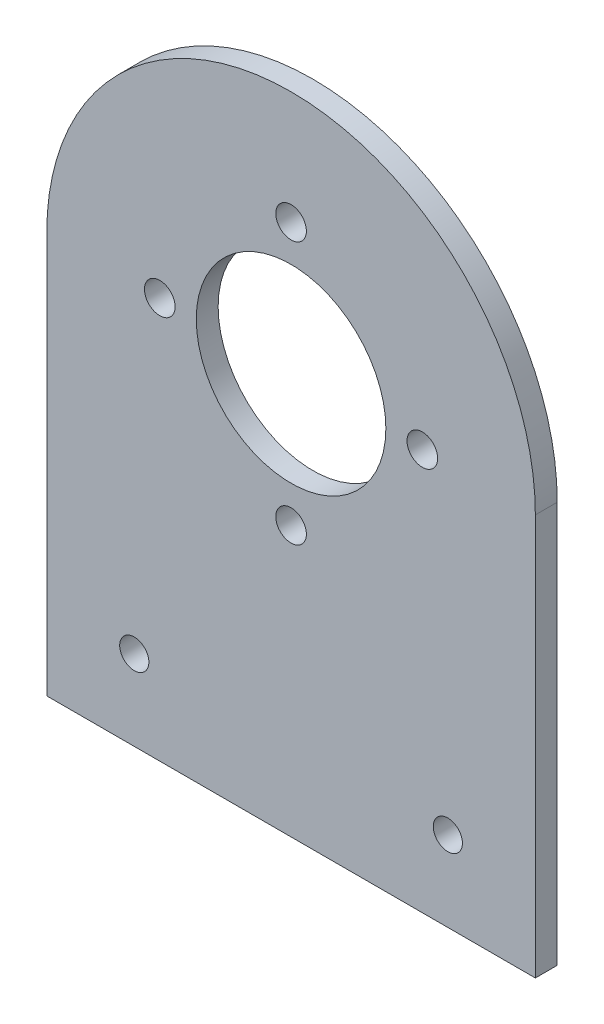
ISO-10303-21;
HEADER;
FILE_DESCRIPTION(('STEP AP214'),'2;1');
FILE_NAME('part.step','',(''),(''),'','','');
FILE_SCHEMA(('AUTOMOTIVE_DESIGN { 1 0 10303 214 1 1 1 1 }'));
ENDSEC;
DATA;
#1=APPLICATION_CONTEXT('core data for automotive mechanical design processes');
#2=APPLICATION_PROTOCOL_DEFINITION('international standard','automotive_design',2000,#1);
#3=PRODUCT_CONTEXT('',#1,'mechanical');
#4=PRODUCT('Part','Part','',(#3));
#5=PRODUCT_RELATED_PRODUCT_CATEGORY('part','',(#4));
#6=PRODUCT_DEFINITION_FORMATION('','',#4);
#7=PRODUCT_DEFINITION_CONTEXT('part definition',#1,'design');
#8=PRODUCT_DEFINITION('design','',#6,#7);
#9=PRODUCT_DEFINITION_SHAPE('','',#8);
#10=(LENGTH_UNIT() NAMED_UNIT(*) SI_UNIT(.MILLI.,.METRE.));
#11=(NAMED_UNIT(*) PLANE_ANGLE_UNIT() SI_UNIT($,.RADIAN.));
#12=(NAMED_UNIT(*) SI_UNIT($,.STERADIAN.) SOLID_ANGLE_UNIT());
#13=UNCERTAINTY_MEASURE_WITH_UNIT(LENGTH_MEASURE(1.E-05),#10,'distance_accuracy_value','');
#14=(GEOMETRIC_REPRESENTATION_CONTEXT(3) GLOBAL_UNCERTAINTY_ASSIGNED_CONTEXT((#13)) GLOBAL_UNIT_ASSIGNED_CONTEXT((#10,
#11,#12)) REPRESENTATION_CONTEXT('',''));
#15=CARTESIAN_POINT('',(0.,0.,0.));
#16=DIRECTION('',(0.,0.,1.));
#17=DIRECTION('',(1.,0.,0.));
#18=AXIS2_PLACEMENT_3D('',#15,#16,#17);
#19=CARTESIAN_POINT('',(0.,55.,3.));
#20=DIRECTION('',(0.,0.,1.));
#21=DIRECTION('',(1.,0.,0.));
#22=AXIS2_PLACEMENT_3D('',#19,#20,#21);
#23=PLANE('',#22);
#24=CARTESIAN_POINT('',(21.5,11.,3.));
#25=DIRECTION('',(0.,0.,1.));
#26=DIRECTION('',(-1.,0.,0.));
#27=AXIS2_PLACEMENT_3D('',#24,#25,#26);
#28=CIRCLE('',#27,2.);
#29=CARTESIAN_POINT('',(19.5,11.,3.));
#30=VERTEX_POINT('',#29);
#31=EDGE_CURVE('E149',#30,#30,#28,.T.);
#32=ORIENTED_EDGE('',*,*,#31,.F.);
#33=EDGE_LOOP('',(#32));
#34=FACE_BOUND('',#33,.T.);
#35=CARTESIAN_POINT('',(-18.,55.0000000000001,3.));
#36=DIRECTION('',(0.,0.,1.));
#37=DIRECTION('',(1.,0.,0.));
#38=AXIS2_PLACEMENT_3D('',#35,#36,#37);
#39=CIRCLE('',#38,2.1);
#40=CARTESIAN_POINT('',(-15.9,55.0000000000001,3.));
#41=VERTEX_POINT('',#40);
#42=EDGE_CURVE('E137',#41,#41,#39,.T.);
#43=ORIENTED_EDGE('',*,*,#42,.F.);
#44=EDGE_LOOP('',(#43));
#45=FACE_BOUND('',#44,.T.);
#46=CARTESIAN_POINT('',(0.,37.,3.));
#47=DIRECTION('',(0.,0.,1.));
#48=DIRECTION('',(1.,0.,0.));
#49=AXIS2_PLACEMENT_3D('',#46,#47,#48);
#50=CIRCLE('',#49,2.1);
#51=CARTESIAN_POINT('',(2.1,37.,3.));
#52=VERTEX_POINT('',#51);
#53=EDGE_CURVE('E125',#52,#52,#50,.T.);
#54=ORIENTED_EDGE('',*,*,#53,.F.);
#55=EDGE_LOOP('',(#54));
#56=FACE_BOUND('',#55,.T.);
#57=DIRECTION('',(0.,-1.,0.));
#58=VECTOR('',#57,1.);
#59=CARTESIAN_POINT('',(-33.5,55.,3.));
#60=LINE('',#59,#58);
#61=CARTESIAN_POINT('',(-33.5,55.,3.));
#62=VERTEX_POINT('',#61);
#63=CARTESIAN_POINT('',(-33.5,0.,3.));
#64=VERTEX_POINT('',#63);
#65=EDGE_CURVE('E95',#62,#64,#60,.T.);
#66=ORIENTED_EDGE('',*,*,#65,.T.);
#67=DIRECTION('',(1.,0.,0.));
#68=VECTOR('',#67,1.);
#69=CARTESIAN_POINT('',(-33.5,0.,3.));
#70=LINE('',#69,#68);
#71=CARTESIAN_POINT('',(33.5,0.,3.));
#72=VERTEX_POINT('',#71);
#73=EDGE_CURVE('E90',#64,#72,#70,.T.);
#74=ORIENTED_EDGE('',*,*,#73,.T.);
#75=DIRECTION('',(0.,1.,0.));
#76=VECTOR('',#75,1.);
#77=CARTESIAN_POINT('',(33.5,0.,3.));
#78=LINE('',#77,#76);
#79=CARTESIAN_POINT('',(33.5,55.,3.));
#80=VERTEX_POINT('',#79);
#81=EDGE_CURVE('E93',#72,#80,#78,.T.);
#82=ORIENTED_EDGE('',*,*,#81,.T.);
#83=CARTESIAN_POINT('',(0.,55.,3.));
#84=DIRECTION('',(0.,0.,1.));
#85=DIRECTION('',(1.,0.,0.));
#86=AXIS2_PLACEMENT_3D('',#83,#84,#85);
#87=CIRCLE('',#86,33.5);
#88=EDGE_CURVE('E60',#80,#62,#87,.T.);
#89=ORIENTED_EDGE('',*,*,#88,.T.);
#90=EDGE_LOOP('',(#66,#74,#82,#89));
#91=FACE_BOUND('',#90,.T.);
#92=CARTESIAN_POINT('',(0.,55.,3.));
#93=DIRECTION('',(0.,0.,1.));
#94=DIRECTION('',(1.,0.,0.));
#95=AXIS2_PLACEMENT_3D('',#92,#93,#94);
#96=CIRCLE('',#95,13.);
#97=CARTESIAN_POINT('',(13.,55.,3.));
#98=VERTEX_POINT('',#97);
#99=EDGE_CURVE('E110',#98,#98,#96,.T.);
#100=ORIENTED_EDGE('',*,*,#99,.F.);
#101=EDGE_LOOP('',(#100));
#102=FACE_BOUND('',#101,.T.);
#103=CARTESIAN_POINT('',(-21.5,11.,3.));
#104=DIRECTION('',(0.,0.,1.));
#105=DIRECTION('',(1.,0.,0.));
#106=AXIS2_PLACEMENT_3D('',#103,#104,#105);
#107=CIRCLE('',#106,2.);
#108=CARTESIAN_POINT('',(-19.5,11.,3.));
#109=VERTEX_POINT('',#108);
#110=EDGE_CURVE('E131',#109,#109,#107,.T.);
#111=ORIENTED_EDGE('',*,*,#110,.F.);
#112=EDGE_LOOP('',(#111));
#113=FACE_BOUND('',#112,.T.);
#114=CARTESIAN_POINT('',(1.30102056675283E-13,73.,3.));
#115=DIRECTION('',(0.,0.,1.));
#116=DIRECTION('',(1.,0.,0.));
#117=AXIS2_PLACEMENT_3D('',#114,#115,#116);
#118=CIRCLE('',#117,2.1);
#119=CARTESIAN_POINT('',(2.10000000000013,73.,3.));
#120=VERTEX_POINT('',#119);
#121=EDGE_CURVE('E143',#120,#120,#118,.T.);
#122=ORIENTED_EDGE('',*,*,#121,.F.);
#123=EDGE_LOOP('',(#122));
#124=FACE_BOUND('',#123,.T.);
#125=CARTESIAN_POINT('',(18.,54.9999999999998,3.));
#126=DIRECTION('',(0.,0.,1.));
#127=DIRECTION('',(1.,0.,0.));
#128=AXIS2_PLACEMENT_3D('',#125,#126,#127);
#129=CIRCLE('',#128,2.1);
#130=CARTESIAN_POINT('',(20.1,54.9999999999998,3.));
#131=VERTEX_POINT('',#130);
#132=EDGE_CURVE('E155',#131,#131,#129,.T.);
#133=ORIENTED_EDGE('',*,*,#132,.F.);
#134=EDGE_LOOP('',(#133));
#135=FACE_BOUND('',#134,.T.);
#136=ADVANCED_FACE('F43',(#34,#45,#56,#91,#102,#113,#124,#135),#23,.T.);
#137=CARTESIAN_POINT('',(0.,55.,0.));
#138=DIRECTION('',(0.,0.,1.));
#139=DIRECTION('',(1.,0.,0.));
#140=AXIS2_PLACEMENT_3D('',#137,#138,#139);
#141=PLANE('',#140);
#142=DIRECTION('',(0.,-1.,0.));
#143=VECTOR('',#142,1.);
#144=CARTESIAN_POINT('',(-33.5,55.,0.));
#145=LINE('',#144,#143);
#146=CARTESIAN_POINT('',(-33.5,55.,0.));
#147=VERTEX_POINT('',#146);
#148=CARTESIAN_POINT('',(-33.5,0.,0.));
#149=VERTEX_POINT('',#148);
#150=EDGE_CURVE('E107',#147,#149,#145,.T.);
#151=ORIENTED_EDGE('',*,*,#150,.F.);
#152=CARTESIAN_POINT('',(0.,55.,0.));
#153=DIRECTION('',(0.,0.,1.));
#154=DIRECTION('',(1.,0.,0.));
#155=AXIS2_PLACEMENT_3D('',#152,#153,#154);
#156=CIRCLE('',#155,33.5);
#157=CARTESIAN_POINT('',(33.5,55.,0.));
#158=VERTEX_POINT('',#157);
#159=EDGE_CURVE('E83',#158,#147,#156,.T.);
#160=ORIENTED_EDGE('',*,*,#159,.F.);
#161=DIRECTION('',(0.,1.,0.));
#162=VECTOR('',#161,1.);
#163=CARTESIAN_POINT('',(33.5,0.,0.));
#164=LINE('',#163,#162);
#165=CARTESIAN_POINT('',(33.5,0.,0.));
#166=VERTEX_POINT('',#165);
#167=EDGE_CURVE('E77',#166,#158,#164,.T.);
#168=ORIENTED_EDGE('',*,*,#167,.F.);
#169=DIRECTION('',(1.,0.,0.));
#170=VECTOR('',#169,1.);
#171=CARTESIAN_POINT('',(-33.5,0.,0.));
#172=LINE('',#171,#170);
#173=EDGE_CURVE('E99',#149,#166,#172,.T.);
#174=ORIENTED_EDGE('',*,*,#173,.F.);
#175=EDGE_LOOP('',(#151,#160,#168,#174));
#176=FACE_BOUND('',#175,.T.);
#177=CARTESIAN_POINT('',(0.,55.,0.));
#178=DIRECTION('',(0.,0.,1.));
#179=DIRECTION('',(1.,0.,0.));
#180=AXIS2_PLACEMENT_3D('',#177,#178,#179);
#181=CIRCLE('',#180,13.);
#182=CARTESIAN_POINT('',(13.,55.,0.));
#183=VERTEX_POINT('',#182);
#184=EDGE_CURVE('E122',#183,#183,#181,.T.);
#185=ORIENTED_EDGE('',*,*,#184,.T.);
#186=EDGE_LOOP('',(#185));
#187=FACE_BOUND('',#186,.T.);
#188=CARTESIAN_POINT('',(0.,37.,0.));
#189=DIRECTION('',(0.,0.,1.));
#190=DIRECTION('',(1.,0.,0.));
#191=AXIS2_PLACEMENT_3D('',#188,#189,#190);
#192=CIRCLE('',#191,2.1);
#193=CARTESIAN_POINT('',(2.1,37.,0.));
#194=VERTEX_POINT('',#193);
#195=EDGE_CURVE('E128',#194,#194,#192,.T.);
#196=ORIENTED_EDGE('',*,*,#195,.T.);
#197=EDGE_LOOP('',(#196));
#198=FACE_BOUND('',#197,.T.);
#199=CARTESIAN_POINT('',(-21.5,11.,0.));
#200=DIRECTION('',(0.,0.,1.));
#201=DIRECTION('',(1.,0.,0.));
#202=AXIS2_PLACEMENT_3D('',#199,#200,#201);
#203=CIRCLE('',#202,2.);
#204=CARTESIAN_POINT('',(-19.5,11.,0.));
#205=VERTEX_POINT('',#204);
#206=EDGE_CURVE('E134',#205,#205,#203,.T.);
#207=ORIENTED_EDGE('',*,*,#206,.T.);
#208=EDGE_LOOP('',(#207));
#209=FACE_BOUND('',#208,.T.);
#210=CARTESIAN_POINT('',(-18.,55.0000000000001,0.));
#211=DIRECTION('',(0.,0.,1.));
#212=DIRECTION('',(1.,0.,0.));
#213=AXIS2_PLACEMENT_3D('',#210,#211,#212);
#214=CIRCLE('',#213,2.1);
#215=CARTESIAN_POINT('',(-15.9,55.0000000000001,0.));
#216=VERTEX_POINT('',#215);
#217=EDGE_CURVE('E140',#216,#216,#214,.T.);
#218=ORIENTED_EDGE('',*,*,#217,.T.);
#219=EDGE_LOOP('',(#218));
#220=FACE_BOUND('',#219,.T.);
#221=CARTESIAN_POINT('',(1.30102056675283E-13,73.,0.));
#222=DIRECTION('',(0.,0.,1.));
#223=DIRECTION('',(1.,0.,0.));
#224=AXIS2_PLACEMENT_3D('',#221,#222,#223);
#225=CIRCLE('',#224,2.1);
#226=CARTESIAN_POINT('',(2.10000000000013,73.,0.));
#227=VERTEX_POINT('',#226);
#228=EDGE_CURVE('E146',#227,#227,#225,.T.);
#229=ORIENTED_EDGE('',*,*,#228,.T.);
#230=EDGE_LOOP('',(#229));
#231=FACE_BOUND('',#230,.T.);
#232=CARTESIAN_POINT('',(21.5,11.,0.));
#233=DIRECTION('',(0.,0.,1.));
#234=DIRECTION('',(-1.,0.,0.));
#235=AXIS2_PLACEMENT_3D('',#232,#233,#234);
#236=CIRCLE('',#235,2.);
#237=CARTESIAN_POINT('',(19.5,11.,0.));
#238=VERTEX_POINT('',#237);
#239=EDGE_CURVE('E152',#238,#238,#236,.T.);
#240=ORIENTED_EDGE('',*,*,#239,.T.);
#241=EDGE_LOOP('',(#240));
#242=FACE_BOUND('',#241,.T.);
#243=CARTESIAN_POINT('',(18.,54.9999999999998,0.));
#244=DIRECTION('',(0.,0.,1.));
#245=DIRECTION('',(1.,0.,0.));
#246=AXIS2_PLACEMENT_3D('',#243,#244,#245);
#247=CIRCLE('',#246,2.1);
#248=CARTESIAN_POINT('',(20.1,54.9999999999998,0.));
#249=VERTEX_POINT('',#248);
#250=EDGE_CURVE('E158',#249,#249,#247,.T.);
#251=ORIENTED_EDGE('',*,*,#250,.T.);
#252=EDGE_LOOP('',(#251));
#253=FACE_BOUND('',#252,.T.);
#254=ADVANCED_FACE('F118',(#176,#187,#198,#209,#220,#231,#242,#253),#141,.F.);
#255=CARTESIAN_POINT('',(-33.5,55.,3.));
#256=DIRECTION('',(1.,0.,0.));
#257=DIRECTION('',(0.,1.,0.));
#258=AXIS2_PLACEMENT_3D('',#255,#256,#257);
#259=PLANE('',#258);
#260=ORIENTED_EDGE('',*,*,#150,.T.);
#261=DIRECTION('',(0.,0.,-1.));
#262=VECTOR('',#261,1.);
#263=CARTESIAN_POINT('',(-33.5,0.,3.));
#264=LINE('',#263,#262);
#265=EDGE_CURVE('E11',#64,#149,#264,.T.);
#266=ORIENTED_EDGE('',*,*,#265,.F.);
#267=ORIENTED_EDGE('',*,*,#65,.F.);
#268=DIRECTION('',(0.,0.,-1.));
#269=VECTOR('',#268,1.);
#270=CARTESIAN_POINT('',(-33.5,55.,3.));
#271=LINE('',#270,#269);
#272=EDGE_CURVE('E103',#62,#147,#271,.T.);
#273=ORIENTED_EDGE('',*,*,#272,.T.);
#274=EDGE_LOOP('',(#260,#266,#267,#273));
#275=FACE_BOUND('',#274,.T.);
#276=ADVANCED_FACE('F45',(#275),#259,.F.);
#277=CARTESIAN_POINT('',(-33.5,0.,3.));
#278=DIRECTION('',(0.,1.,0.));
#279=DIRECTION('',(-1.,0.,0.));
#280=AXIS2_PLACEMENT_3D('',#277,#278,#279);
#281=PLANE('',#280);
#282=ORIENTED_EDGE('',*,*,#173,.T.);
#283=DIRECTION('',(0.,0.,-1.));
#284=VECTOR('',#283,1.);
#285=CARTESIAN_POINT('',(33.5,0.,3.));
#286=LINE('',#285,#284);
#287=EDGE_CURVE('E52',#72,#166,#286,.T.);
#288=ORIENTED_EDGE('',*,*,#287,.F.);
#289=ORIENTED_EDGE('',*,*,#73,.F.);
#290=ORIENTED_EDGE('',*,*,#265,.T.);
#291=EDGE_LOOP('',(#282,#288,#289,#290));
#292=FACE_BOUND('',#291,.T.);
#293=ADVANCED_FACE('F98',(#292),#281,.F.);
#294=CARTESIAN_POINT('',(33.5,0.,3.));
#295=DIRECTION('',(-1.,0.,0.));
#296=DIRECTION('',(0.,-1.,0.));
#297=AXIS2_PLACEMENT_3D('',#294,#295,#296);
#298=PLANE('',#297);
#299=ORIENTED_EDGE('',*,*,#167,.T.);
#300=DIRECTION('',(0.,0.,-1.));
#301=VECTOR('',#300,1.);
#302=CARTESIAN_POINT('',(33.5,55.,3.));
#303=LINE('',#302,#301);
#304=EDGE_CURVE('E100',#80,#158,#303,.T.);
#305=ORIENTED_EDGE('',*,*,#304,.F.);
#306=ORIENTED_EDGE('',*,*,#81,.F.);
#307=ORIENTED_EDGE('',*,*,#287,.T.);
#308=EDGE_LOOP('',(#299,#305,#306,#307));
#309=FACE_BOUND('',#308,.T.);
#310=ADVANCED_FACE('F101',(#309),#298,.F.);
#311=CARTESIAN_POINT('',(0.,55.,3.));
#312=DIRECTION('',(0.,0.,-1.));
#313=DIRECTION('',(-1.,0.,0.));
#314=AXIS2_PLACEMENT_3D('',#311,#312,#313);
#315=CYLINDRICAL_SURFACE('',#314,33.5);
#316=ORIENTED_EDGE('',*,*,#159,.T.);
#317=ORIENTED_EDGE('',*,*,#272,.F.);
#318=ORIENTED_EDGE('',*,*,#88,.F.);
#319=ORIENTED_EDGE('',*,*,#304,.T.);
#320=EDGE_LOOP('',(#316,#317,#318,#319));
#321=FACE_BOUND('',#320,.T.);
#322=ADVANCED_FACE('F115',(#321),#315,.T.);
#323=CARTESIAN_POINT('',(0.,55.,3.));
#324=DIRECTION('',(0.,0.,-1.));
#325=DIRECTION('',(-1.,0.,0.));
#326=AXIS2_PLACEMENT_3D('',#323,#324,#325);
#327=CYLINDRICAL_SURFACE('',#326,13.);
#328=ORIENTED_EDGE('',*,*,#99,.T.);
#329=EDGE_LOOP('',(#328));
#330=FACE_BOUND('',#329,.T.);
#331=ORIENTED_EDGE('',*,*,#184,.F.);
#332=EDGE_LOOP('',(#331));
#333=FACE_BOUND('',#332,.T.);
#334=ADVANCED_FACE('F177',(#330,#333),#327,.F.);
#335=CARTESIAN_POINT('',(0.,37.,3.));
#336=DIRECTION('',(0.,0.,-1.));
#337=DIRECTION('',(-1.,0.,0.));
#338=AXIS2_PLACEMENT_3D('',#335,#336,#337);
#339=CYLINDRICAL_SURFACE('',#338,2.1);
#340=ORIENTED_EDGE('',*,*,#53,.T.);
#341=EDGE_LOOP('',(#340));
#342=FACE_BOUND('',#341,.T.);
#343=ORIENTED_EDGE('',*,*,#195,.F.);
#344=EDGE_LOOP('',(#343));
#345=FACE_BOUND('',#344,.T.);
#346=ADVANCED_FACE('F222',(#342,#345),#339,.F.);
#347=CARTESIAN_POINT('',(-21.5,11.,3.));
#348=DIRECTION('',(0.,0.,-1.));
#349=DIRECTION('',(-1.,0.,0.));
#350=AXIS2_PLACEMENT_3D('',#347,#348,#349);
#351=CYLINDRICAL_SURFACE('',#350,2.);
#352=ORIENTED_EDGE('',*,*,#110,.T.);
#353=EDGE_LOOP('',(#352));
#354=FACE_BOUND('',#353,.T.);
#355=ORIENTED_EDGE('',*,*,#206,.F.);
#356=EDGE_LOOP('',(#355));
#357=FACE_BOUND('',#356,.T.);
#358=ADVANCED_FACE('F230',(#354,#357),#351,.F.);
#359=CARTESIAN_POINT('',(-18.,55.0000000000001,3.));
#360=DIRECTION('',(0.,0.,-1.));
#361=DIRECTION('',(-1.,0.,0.));
#362=AXIS2_PLACEMENT_3D('',#359,#360,#361);
#363=CYLINDRICAL_SURFACE('',#362,2.1);
#364=ORIENTED_EDGE('',*,*,#42,.T.);
#365=EDGE_LOOP('',(#364));
#366=FACE_BOUND('',#365,.T.);
#367=ORIENTED_EDGE('',*,*,#217,.F.);
#368=EDGE_LOOP('',(#367));
#369=FACE_BOUND('',#368,.T.);
#370=ADVANCED_FACE('F238',(#366,#369),#363,.F.);
#371=CARTESIAN_POINT('',(1.30102056675283E-13,73.,3.));
#372=DIRECTION('',(0.,0.,-1.));
#373=DIRECTION('',(-1.,0.,0.));
#374=AXIS2_PLACEMENT_3D('',#371,#372,#373);
#375=CYLINDRICAL_SURFACE('',#374,2.1);
#376=ORIENTED_EDGE('',*,*,#121,.T.);
#377=EDGE_LOOP('',(#376));
#378=FACE_BOUND('',#377,.T.);
#379=ORIENTED_EDGE('',*,*,#228,.F.);
#380=EDGE_LOOP('',(#379));
#381=FACE_BOUND('',#380,.T.);
#382=ADVANCED_FACE('F247',(#378,#381),#375,.F.);
#383=CARTESIAN_POINT('',(21.5,11.,3.));
#384=DIRECTION('',(0.,0.,-1.));
#385=DIRECTION('',(-1.,0.,0.));
#386=AXIS2_PLACEMENT_3D('',#383,#384,#385);
#387=CYLINDRICAL_SURFACE('',#386,2.);
#388=ORIENTED_EDGE('',*,*,#31,.T.);
#389=EDGE_LOOP('',(#388));
#390=FACE_BOUND('',#389,.T.);
#391=ORIENTED_EDGE('',*,*,#239,.F.);
#392=EDGE_LOOP('',(#391));
#393=FACE_BOUND('',#392,.T.);
#394=ADVANCED_FACE('F256',(#390,#393),#387,.F.);
#395=CARTESIAN_POINT('',(18.,54.9999999999998,3.));
#396=DIRECTION('',(0.,0.,-1.));
#397=DIRECTION('',(-1.,0.,0.));
#398=AXIS2_PLACEMENT_3D('',#395,#396,#397);
#399=CYLINDRICAL_SURFACE('',#398,2.1);
#400=ORIENTED_EDGE('',*,*,#132,.T.);
#401=EDGE_LOOP('',(#400));
#402=FACE_BOUND('',#401,.T.);
#403=ORIENTED_EDGE('',*,*,#250,.F.);
#404=EDGE_LOOP('',(#403));
#405=FACE_BOUND('',#404,.T.);
#406=ADVANCED_FACE('F164',(#402,#405),#399,.F.);
#407=CLOSED_SHELL('',(#136,#254,#276,#293,#310,#322,#334,#346,#358,#370,#382,#394,#406));
#408=MANIFOLD_SOLID_BREP('B2',#407);
#409=ADVANCED_BREP_SHAPE_REPRESENTATION('',(#18,#408),#14);
#410=SHAPE_DEFINITION_REPRESENTATION(#9,#409);
ENDSEC;
END-ISO-10303-21;
